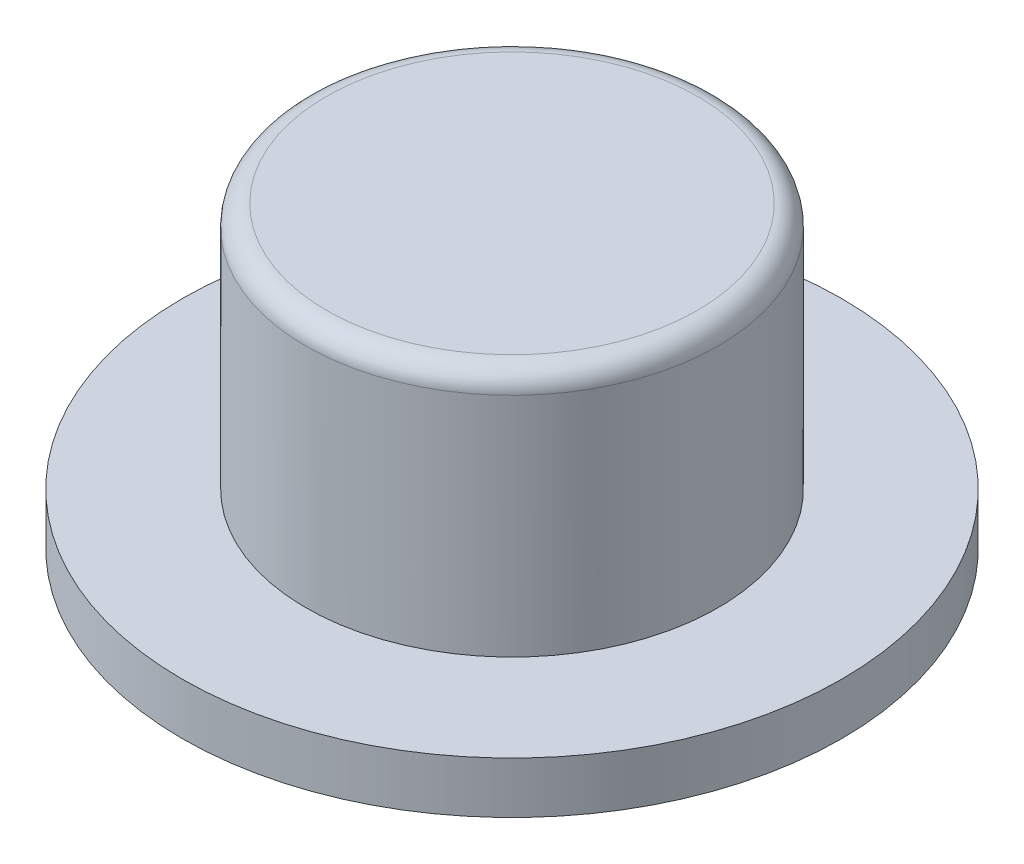
ISO-10303-21;
HEADER;
FILE_DESCRIPTION(('STEP AP214'),'2;1');
FILE_NAME('part.step','',(''),(''),'','','');
FILE_SCHEMA(('AUTOMOTIVE_DESIGN { 1 0 10303 214 1 1 1 1 }'));
ENDSEC;
DATA;
#1=APPLICATION_CONTEXT('core data for automotive mechanical design processes');
#2=APPLICATION_PROTOCOL_DEFINITION('international standard','automotive_design',2000,#1);
#3=PRODUCT_CONTEXT('',#1,'mechanical');
#4=PRODUCT('Part','Part','',(#3));
#5=PRODUCT_RELATED_PRODUCT_CATEGORY('part','',(#4));
#6=PRODUCT_DEFINITION_FORMATION('','',#4);
#7=PRODUCT_DEFINITION_CONTEXT('part definition',#1,'design');
#8=PRODUCT_DEFINITION('design','',#6,#7);
#9=PRODUCT_DEFINITION_SHAPE('','',#8);
#10=(LENGTH_UNIT() NAMED_UNIT(*) SI_UNIT(.MILLI.,.METRE.));
#11=(NAMED_UNIT(*) PLANE_ANGLE_UNIT() SI_UNIT($,.RADIAN.));
#12=(NAMED_UNIT(*) SI_UNIT($,.STERADIAN.) SOLID_ANGLE_UNIT());
#13=UNCERTAINTY_MEASURE_WITH_UNIT(LENGTH_MEASURE(1.E-05),#10,'distance_accuracy_value','');
#14=(GEOMETRIC_REPRESENTATION_CONTEXT(3) GLOBAL_UNCERTAINTY_ASSIGNED_CONTEXT((#13)) GLOBAL_UNIT_ASSIGNED_CONTEXT((#10,
#11,#12)) REPRESENTATION_CONTEXT('',''));
#15=CARTESIAN_POINT('',(0.,0.,0.));
#16=DIRECTION('',(0.,0.,1.));
#17=DIRECTION('',(1.,0.,0.));
#18=AXIS2_PLACEMENT_3D('',#15,#16,#17);
#19=CARTESIAN_POINT('',(0.,0.,0.));
#20=DIRECTION('',(0.,1.,0.));
#21=DIRECTION('',(-1.,0.,0.));
#22=AXIS2_PLACEMENT_3D('',#19,#20,#21);
#23=PLANE('',#22);
#24=CARTESIAN_POINT('',(0.,0.,0.));
#25=DIRECTION('',(0.,1.,0.));
#26=DIRECTION('',(-1.,0.,0.));
#27=AXIS2_PLACEMENT_3D('',#24,#25,#26);
#28=CIRCLE('',#27,7.99999999999998);
#29=CARTESIAN_POINT('',(-7.99999999999996,0.,0.));
#30=VERTEX_POINT('',#29);
#31=EDGE_CURVE('E116',#30,#30,#28,.T.);
#32=ORIENTED_EDGE('',*,*,#31,.F.);
#33=EDGE_LOOP('',(#32));
#34=FACE_BOUND('',#33,.T.);
#35=DIRECTION('',(0.,0.,1.));
#36=VECTOR('',#35,1.);
#37=CARTESIAN_POINT('',(-1.25,0.,-1.75));
#38=LINE('',#37,#36);
#39=CARTESIAN_POINT('',(-1.25,0.,-1.75));
#40=VERTEX_POINT('',#39);
#41=CARTESIAN_POINT('',(-1.25,0.,1.75));
#42=VERTEX_POINT('',#41);
#43=EDGE_CURVE('E48',#40,#42,#38,.T.);
#44=ORIENTED_EDGE('',*,*,#43,.T.);
#45=DIRECTION('',(1.,0.,0.));
#46=VECTOR('',#45,1.);
#47=CARTESIAN_POINT('',(-1.25,0.,1.75));
#48=LINE('',#47,#46);
#49=CARTESIAN_POINT('',(1.25,0.,1.75));
#50=VERTEX_POINT('',#49);
#51=EDGE_CURVE('E102',#42,#50,#48,.T.);
#52=ORIENTED_EDGE('',*,*,#51,.T.);
#53=DIRECTION('',(0.,0.,1.));
#54=VECTOR('',#53,1.);
#55=CARTESIAN_POINT('',(1.25,0.,-1.75));
#56=LINE('',#55,#54);
#57=CARTESIAN_POINT('',(1.25,0.,-1.75));
#58=VERTEX_POINT('',#57);
#59=EDGE_CURVE('E91',#58,#50,#56,.T.);
#60=ORIENTED_EDGE('',*,*,#59,.F.);
#61=DIRECTION('',(1.,0.,0.));
#62=VECTOR('',#61,1.);
#63=CARTESIAN_POINT('',(-1.25,0.,-1.75));
#64=LINE('',#63,#62);
#65=EDGE_CURVE('E105',#40,#58,#64,.T.);
#66=ORIENTED_EDGE('',*,*,#65,.F.);
#67=EDGE_LOOP('',(#44,#52,#60,#66));
#68=FACE_BOUND('',#67,.T.);
#69=ADVANCED_FACE('F33',(#34,#68),#23,.F.);
#70=CARTESIAN_POINT('',(0.,7.25,0.));
#71=DIRECTION('',(0.,1.,0.));
#72=DIRECTION('',(-1.,0.,0.));
#73=AXIS2_PLACEMENT_3D('',#70,#71,#72);
#74=CYLINDRICAL_SURFACE('',#73,7.99999999999998);
#75=CARTESIAN_POINT('',(0.,1.24999999999998,0.));
#76=DIRECTION('',(0.,1.,0.));
#77=DIRECTION('',(-1.,0.,0.));
#78=AXIS2_PLACEMENT_3D('',#75,#76,#77);
#79=CIRCLE('',#78,7.99999999999998);
#80=CARTESIAN_POINT('',(-7.99999999999997,1.24999999999996,0.));
#81=VERTEX_POINT('',#80);
#82=EDGE_CURVE('E113',#81,#81,#79,.T.);
#83=ORIENTED_EDGE('',*,*,#82,.F.);
#84=EDGE_LOOP('',(#83));
#85=FACE_BOUND('',#84,.T.);
#86=ORIENTED_EDGE('',*,*,#31,.T.);
#87=EDGE_LOOP('',(#86));
#88=FACE_BOUND('',#87,.T.);
#89=ADVANCED_FACE('F132',(#85,#88),#74,.T.);
#90=CARTESIAN_POINT('',(5.,1.25,0.));
#91=DIRECTION('',(0.,-1.,0.));
#92=DIRECTION('',(1.,0.,0.));
#93=AXIS2_PLACEMENT_3D('',#90,#91,#92);
#94=PLANE('',#93);
#95=CARTESIAN_POINT('',(0.,1.24999999999999,0.));
#96=DIRECTION('',(0.,1.,0.));
#97=DIRECTION('',(-1.,0.,0.));
#98=AXIS2_PLACEMENT_3D('',#95,#96,#97);
#99=CIRCLE('',#98,4.99999999999998);
#100=CARTESIAN_POINT('',(-4.99999999999997,1.24999999999997,0.));
#101=VERTEX_POINT('',#100);
#102=EDGE_CURVE('E110',#101,#101,#99,.T.);
#103=ORIENTED_EDGE('',*,*,#102,.F.);
#104=EDGE_LOOP('',(#103));
#105=FACE_BOUND('',#104,.T.);
#106=ORIENTED_EDGE('',*,*,#82,.T.);
#107=EDGE_LOOP('',(#106));
#108=FACE_BOUND('',#107,.T.);
#109=ADVANCED_FACE('F137',(#105,#108),#94,.F.);
#110=CARTESIAN_POINT('',(0.,7.25,0.));
#111=DIRECTION('',(0.,1.,0.));
#112=DIRECTION('',(-1.,0.,0.));
#113=AXIS2_PLACEMENT_3D('',#110,#111,#112);
#114=CYLINDRICAL_SURFACE('',#113,4.99999999999999);
#115=CARTESIAN_POINT('',(0.,6.74999999999999,0.));
#116=DIRECTION('',(0.,-1.,0.));
#117=DIRECTION('',(1.,0.,0.));
#118=AXIS2_PLACEMENT_3D('',#115,#116,#117);
#119=CIRCLE('',#118,4.99999999999999);
#120=CARTESIAN_POINT('',(4.99999999999999,6.75000000000001,0.));
#121=VERTEX_POINT('',#120);
#122=EDGE_CURVE('E11',#121,#121,#119,.T.);
#123=ORIENTED_EDGE('',*,*,#122,.T.);
#124=EDGE_LOOP('',(#123));
#125=FACE_BOUND('',#124,.T.);
#126=ORIENTED_EDGE('',*,*,#102,.T.);
#127=EDGE_LOOP('',(#126));
#128=FACE_BOUND('',#127,.T.);
#129=ADVANCED_FACE('F145',(#125,#128),#114,.T.);
#130=CARTESIAN_POINT('',(0.,7.24999999999999,0.));
#131=DIRECTION('',(0.,-1.,0.));
#132=DIRECTION('',(1.,0.,0.));
#133=AXIS2_PLACEMENT_3D('',#130,#131,#132);
#134=PLANE('',#133);
#135=CARTESIAN_POINT('',(0.,7.24999999999999,0.));
#136=DIRECTION('',(0.,-1.,0.));
#137=DIRECTION('',(1.,0.,0.));
#138=AXIS2_PLACEMENT_3D('',#135,#136,#137);
#139=CIRCLE('',#138,4.49999999999999);
#140=CARTESIAN_POINT('',(4.49999999999999,7.25,0.));
#141=VERTEX_POINT('',#140);
#142=EDGE_CURVE('E41',#141,#141,#139,.F.);
#143=ORIENTED_EDGE('',*,*,#142,.T.);
#144=EDGE_LOOP('',(#143));
#145=FACE_BOUND('',#144,.T.);
#146=ADVANCED_FACE('F121',(#145),#134,.F.);
#147=CARTESIAN_POINT('',(-1.25,3.5,-1.75));
#148=DIRECTION('',(1.,0.,0.));
#149=DIRECTION('',(0.,1.,0.));
#150=AXIS2_PLACEMENT_3D('',#147,#148,#149);
#151=PLANE('',#150);
#152=ORIENTED_EDGE('',*,*,#43,.F.);
#153=DIRECTION('',(0.,-1.,0.));
#154=VECTOR('',#153,1.);
#155=CARTESIAN_POINT('',(-1.25,3.5,-1.75));
#156=LINE('',#155,#154);
#157=CARTESIAN_POINT('',(-1.25,3.5,-1.75));
#158=VERTEX_POINT('',#157);
#159=EDGE_CURVE('E53',#158,#40,#156,.T.);
#160=ORIENTED_EDGE('',*,*,#159,.F.);
#161=DIRECTION('',(0.,0.,1.));
#162=VECTOR('',#161,1.);
#163=CARTESIAN_POINT('',(-1.25,3.5,-1.75));
#164=LINE('',#163,#162);
#165=CARTESIAN_POINT('',(-1.25,3.5,1.75));
#166=VERTEX_POINT('',#165);
#167=EDGE_CURVE('E86',#158,#166,#164,.T.);
#168=ORIENTED_EDGE('',*,*,#167,.T.);
#169=DIRECTION('',(0.,-1.,0.));
#170=VECTOR('',#169,1.);
#171=CARTESIAN_POINT('',(-1.25,3.5,1.75));
#172=LINE('',#171,#170);
#173=EDGE_CURVE('E84',#166,#42,#172,.T.);
#174=ORIENTED_EDGE('',*,*,#173,.T.);
#175=EDGE_LOOP('',(#152,#160,#168,#174));
#176=FACE_BOUND('',#175,.T.);
#177=ADVANCED_FACE('F152',(#176),#151,.T.);
#178=CARTESIAN_POINT('',(-1.25,3.5,1.75));
#179=DIRECTION('',(0.,0.,-1.));
#180=DIRECTION('',(-1.,0.,0.));
#181=AXIS2_PLACEMENT_3D('',#178,#179,#180);
#182=PLANE('',#181);
#183=ORIENTED_EDGE('',*,*,#51,.F.);
#184=ORIENTED_EDGE('',*,*,#173,.F.);
#185=DIRECTION('',(1.,0.,0.));
#186=VECTOR('',#185,1.);
#187=CARTESIAN_POINT('',(-1.25,3.5,1.75));
#188=LINE('',#187,#186);
#189=CARTESIAN_POINT('',(1.25,3.5,1.75));
#190=VERTEX_POINT('',#189);
#191=EDGE_CURVE('E78',#166,#190,#188,.T.);
#192=ORIENTED_EDGE('',*,*,#191,.T.);
#193=DIRECTION('',(0.,-1.,0.));
#194=VECTOR('',#193,1.);
#195=CARTESIAN_POINT('',(1.25,3.5,1.75));
#196=LINE('',#195,#194);
#197=EDGE_CURVE('E83',#190,#50,#196,.T.);
#198=ORIENTED_EDGE('',*,*,#197,.T.);
#199=EDGE_LOOP('',(#183,#184,#192,#198));
#200=FACE_BOUND('',#199,.T.);
#201=ADVANCED_FACE('F82',(#200),#182,.T.);
#202=CARTESIAN_POINT('',(1.25,3.5,-1.75));
#203=DIRECTION('',(1.,0.,0.));
#204=DIRECTION('',(0.,1.,0.));
#205=AXIS2_PLACEMENT_3D('',#202,#203,#204);
#206=PLANE('',#205);
#207=ORIENTED_EDGE('',*,*,#59,.T.);
#208=ORIENTED_EDGE('',*,*,#197,.F.);
#209=DIRECTION('',(0.,0.,1.));
#210=VECTOR('',#209,1.);
#211=CARTESIAN_POINT('',(1.25,3.5,-1.75));
#212=LINE('',#211,#210);
#213=CARTESIAN_POINT('',(1.25,3.5,-1.75));
#214=VERTEX_POINT('',#213);
#215=EDGE_CURVE('E85',#214,#190,#212,.T.);
#216=ORIENTED_EDGE('',*,*,#215,.F.);
#217=DIRECTION('',(0.,-1.,0.));
#218=VECTOR('',#217,1.);
#219=CARTESIAN_POINT('',(1.25,3.5,-1.75));
#220=LINE('',#219,#218);
#221=EDGE_CURVE('E71',#214,#58,#220,.T.);
#222=ORIENTED_EDGE('',*,*,#221,.T.);
#223=EDGE_LOOP('',(#207,#208,#216,#222));
#224=FACE_BOUND('',#223,.T.);
#225=ADVANCED_FACE('F88',(#224),#206,.F.);
#226=CARTESIAN_POINT('',(-1.25,3.5,-1.75));
#227=DIRECTION('',(0.,0.,-1.));
#228=DIRECTION('',(-1.,0.,0.));
#229=AXIS2_PLACEMENT_3D('',#226,#227,#228);
#230=PLANE('',#229);
#231=ORIENTED_EDGE('',*,*,#65,.T.);
#232=ORIENTED_EDGE('',*,*,#221,.F.);
#233=DIRECTION('',(1.,0.,0.));
#234=VECTOR('',#233,1.);
#235=CARTESIAN_POINT('',(-1.25,3.5,-1.75));
#236=LINE('',#235,#234);
#237=EDGE_CURVE('E96',#158,#214,#236,.T.);
#238=ORIENTED_EDGE('',*,*,#237,.F.);
#239=ORIENTED_EDGE('',*,*,#159,.T.);
#240=EDGE_LOOP('',(#231,#232,#238,#239));
#241=FACE_BOUND('',#240,.T.);
#242=ADVANCED_FACE('F128',(#241),#230,.F.);
#243=CARTESIAN_POINT('',(0.,3.5,0.));
#244=DIRECTION('',(0.,1.,0.));
#245=DIRECTION('',(-1.,0.,0.));
#246=AXIS2_PLACEMENT_3D('',#243,#244,#245);
#247=PLANE('',#246);
#248=ORIENTED_EDGE('',*,*,#167,.F.);
#249=ORIENTED_EDGE('',*,*,#237,.T.);
#250=ORIENTED_EDGE('',*,*,#215,.T.);
#251=ORIENTED_EDGE('',*,*,#191,.F.);
#252=EDGE_LOOP('',(#248,#249,#250,#251));
#253=FACE_BOUND('',#252,.T.);
#254=ADVANCED_FACE('F94',(#253),#247,.F.);
#255=CARTESIAN_POINT('',(0.,6.74999999999999,0.));
#256=DIRECTION('',(0.,-1.,0.));
#257=DIRECTION('',(1.,0.,0.));
#258=AXIS2_PLACEMENT_3D('',#255,#256,#257);
#259=TOROIDAL_SURFACE('',#258,4.49999999999999,0.5);
#260=ORIENTED_EDGE('',*,*,#122,.F.);
#261=EDGE_LOOP('',(#260));
#262=FACE_BOUND('',#261,.T.);
#263=ORIENTED_EDGE('',*,*,#142,.F.);
#264=EDGE_LOOP('',(#263));
#265=FACE_BOUND('',#264,.T.);
#266=ADVANCED_FACE('F35',(#262,#265),#259,.T.);
#267=CLOSED_SHELL('',(#69,#89,#109,#129,#146,#177,#201,#225,#242,#254,#266));
#268=MANIFOLD_SOLID_BREP('B2',#267);
#269=ADVANCED_BREP_SHAPE_REPRESENTATION('',(#18,#268),#14);
#270=SHAPE_DEFINITION_REPRESENTATION(#9,#269);
ENDSEC;
END-ISO-10303-21;
